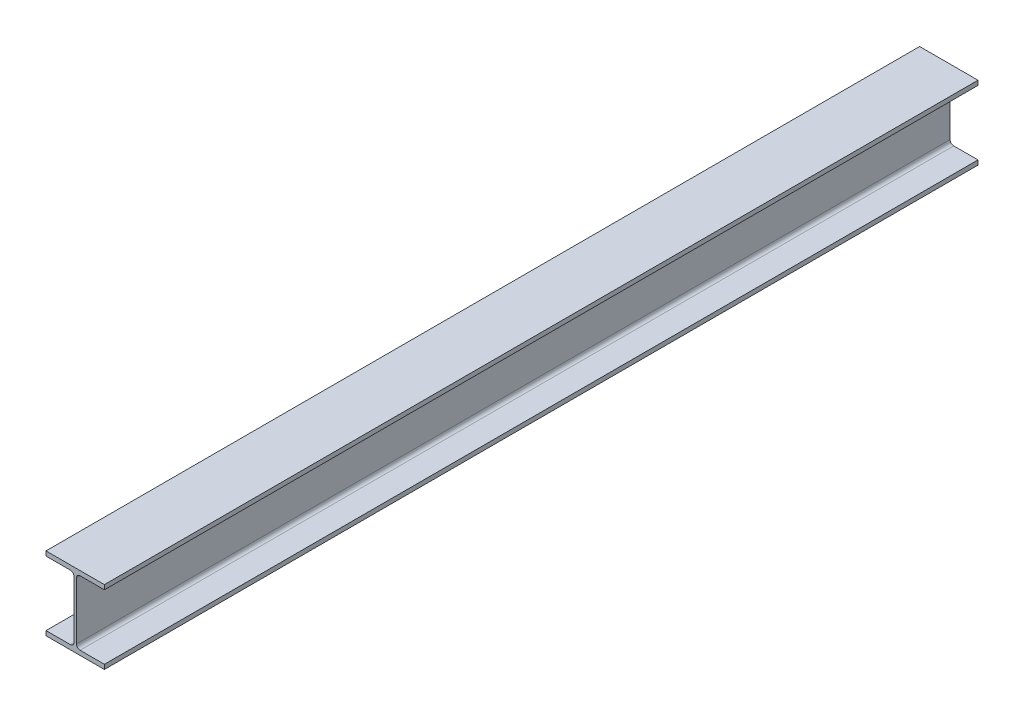
ISO-10303-21;
HEADER;
FILE_DESCRIPTION(('STEP AP214'),'2;1');
FILE_NAME('part.step','',(''),(''),'','','');
FILE_SCHEMA(('AUTOMOTIVE_DESIGN { 1 0 10303 214 1 1 1 1 }'));
ENDSEC;
DATA;
#1=APPLICATION_CONTEXT('core data for automotive mechanical design processes');
#2=APPLICATION_PROTOCOL_DEFINITION('international standard','automotive_design',2000,#1);
#3=PRODUCT_CONTEXT('',#1,'mechanical');
#4=PRODUCT('Part','Part','',(#3));
#5=PRODUCT_RELATED_PRODUCT_CATEGORY('part','',(#4));
#6=PRODUCT_DEFINITION_FORMATION('','',#4);
#7=PRODUCT_DEFINITION_CONTEXT('part definition',#1,'design');
#8=PRODUCT_DEFINITION('design','',#6,#7);
#9=PRODUCT_DEFINITION_SHAPE('','',#8);
#10=(LENGTH_UNIT() NAMED_UNIT(*) SI_UNIT(.MILLI.,.METRE.));
#11=(NAMED_UNIT(*) PLANE_ANGLE_UNIT() SI_UNIT($,.RADIAN.));
#12=(NAMED_UNIT(*) SI_UNIT($,.STERADIAN.) SOLID_ANGLE_UNIT());
#13=UNCERTAINTY_MEASURE_WITH_UNIT(LENGTH_MEASURE(1.E-05),#10,'distance_accuracy_value','');
#14=(GEOMETRIC_REPRESENTATION_CONTEXT(3) GLOBAL_UNCERTAINTY_ASSIGNED_CONTEXT((#13)) GLOBAL_UNIT_ASSIGNED_CONTEXT((#10,
#11,#12)) REPRESENTATION_CONTEXT('',''));
#15=CARTESIAN_POINT('',(0.,0.,0.));
#16=DIRECTION('',(0.,0.,1.));
#17=DIRECTION('',(1.,0.,0.));
#18=AXIS2_PLACEMENT_3D('',#15,#16,#17);
#19=CARTESIAN_POINT('',(203.708,0.,-1524.));
#20=DIRECTION('',(0.,-1.,0.));
#21=DIRECTION('',(0.,0.,-1.));
#22=AXIS2_PLACEMENT_3D('',#19,#20,#21);
#23=PLANE('',#22);
#24=DIRECTION('',(1.,0.,0.));
#25=VECTOR('',#24,1.);
#26=CARTESIAN_POINT('',(203.708,0.,1524.));
#27=LINE('',#26,#25);
#28=CARTESIAN_POINT('',(0.,0.,1524.));
#29=VERTEX_POINT('',#28);
#30=CARTESIAN_POINT('',(203.708,0.,1524.));
#31=VERTEX_POINT('',#30);
#32=EDGE_CURVE('E178',#29,#31,#27,.T.);
#33=ORIENTED_EDGE('',*,*,#32,.F.);
#34=DIRECTION('',(0.,0.,1.));
#35=VECTOR('',#34,1.);
#36=CARTESIAN_POINT('',(0.,0.,-1524.));
#37=LINE('',#36,#35);
#38=CARTESIAN_POINT('',(0.,0.,-1524.));
#39=VERTEX_POINT('',#38);
#40=EDGE_CURVE('E11',#39,#29,#37,.T.);
#41=ORIENTED_EDGE('',*,*,#40,.F.);
#42=DIRECTION('',(1.,0.,0.));
#43=VECTOR('',#42,1.);
#44=CARTESIAN_POINT('',(203.708,0.,-1524.));
#45=LINE('',#44,#43);
#46=CARTESIAN_POINT('',(203.708,0.,-1524.));
#47=VERTEX_POINT('',#46);
#48=EDGE_CURVE('E222',#39,#47,#45,.T.);
#49=ORIENTED_EDGE('',*,*,#48,.T.);
#50=DIRECTION('',(0.,0.,1.));
#51=VECTOR('',#50,1.);
#52=CARTESIAN_POINT('',(203.708,0.,-1524.));
#53=LINE('',#52,#51);
#54=EDGE_CURVE('E36',#47,#31,#53,.T.);
#55=ORIENTED_EDGE('',*,*,#54,.T.);
#56=EDGE_LOOP('',(#33,#41,#49,#55));
#57=FACE_BOUND('',#56,.T.);
#58=ADVANCED_FACE('F33',(#57),#23,.T.);
#59=CARTESIAN_POINT('',(0.,0.,-1524.));
#60=DIRECTION('',(-1.,0.,0.));
#61=DIRECTION('',(0.,-1.,0.));
#62=AXIS2_PLACEMENT_3D('',#59,#60,#61);
#63=PLANE('',#62);
#64=DIRECTION('',(0.,-1.,0.));
#65=VECTOR('',#64,1.);
#66=CARTESIAN_POINT('',(0.,0.,1524.));
#67=LINE('',#66,#65);
#68=CARTESIAN_POINT('',(0.,15.748,1524.));
#69=VERTEX_POINT('',#68);
#70=EDGE_CURVE('E220',#69,#29,#67,.T.);
#71=ORIENTED_EDGE('',*,*,#70,.F.);
#72=DIRECTION('',(0.,0.,1.));
#73=VECTOR('',#72,1.);
#74=CARTESIAN_POINT('',(0.,15.748,-1524.));
#75=LINE('',#74,#73);
#76=CARTESIAN_POINT('',(0.,15.748,-1524.));
#77=VERTEX_POINT('',#76);
#78=EDGE_CURVE('E42',#77,#69,#75,.T.);
#79=ORIENTED_EDGE('',*,*,#78,.F.);
#80=DIRECTION('',(0.,-1.,0.));
#81=VECTOR('',#80,1.);
#82=CARTESIAN_POINT('',(0.,0.,-1524.));
#83=LINE('',#82,#81);
#84=EDGE_CURVE('E168',#77,#39,#83,.T.);
#85=ORIENTED_EDGE('',*,*,#84,.T.);
#86=ORIENTED_EDGE('',*,*,#40,.T.);
#87=EDGE_LOOP('',(#71,#79,#85,#86));
#88=FACE_BOUND('',#87,.T.);
#89=ADVANCED_FACE('F250',(#88),#63,.T.);
#90=CARTESIAN_POINT('',(0.,15.748,-1524.));
#91=DIRECTION('',(0.,1.,0.));
#92=DIRECTION('',(-1.,0.,0.));
#93=AXIS2_PLACEMENT_3D('',#90,#91,#92);
#94=PLANE('',#93);
#95=DIRECTION('',(-1.,0.,0.));
#96=VECTOR('',#95,1.);
#97=CARTESIAN_POINT('',(0.,15.748,1524.));
#98=LINE('',#97,#96);
#99=CARTESIAN_POINT('',(84.709,15.748,1524.));
#100=VERTEX_POINT('',#99);
#101=EDGE_CURVE('E155',#100,#69,#98,.T.);
#102=ORIENTED_EDGE('',*,*,#101,.F.);
#103=DIRECTION('',(0.,0.,1.));
#104=VECTOR('',#103,1.);
#105=CARTESIAN_POINT('',(84.709,15.748,-1524.));
#106=LINE('',#105,#104);
#107=CARTESIAN_POINT('',(84.709,15.748,-1524.));
#108=VERTEX_POINT('',#107);
#109=EDGE_CURVE('E150',#108,#100,#106,.T.);
#110=ORIENTED_EDGE('',*,*,#109,.F.);
#111=DIRECTION('',(-1.,0.,0.));
#112=VECTOR('',#111,1.);
#113=CARTESIAN_POINT('',(0.,15.748,-1524.));
#114=LINE('',#113,#112);
#115=EDGE_CURVE('E153',#108,#77,#114,.T.);
#116=ORIENTED_EDGE('',*,*,#115,.T.);
#117=ORIENTED_EDGE('',*,*,#78,.T.);
#118=EDGE_LOOP('',(#102,#110,#116,#117));
#119=FACE_BOUND('',#118,.T.);
#120=ADVANCED_FACE('F152',(#119),#94,.T.);
#121=CARTESIAN_POINT('',(84.709,28.448,-1524.));
#122=DIRECTION('',(0.,0.,1.));
#123=DIRECTION('',(1.,0.,0.));
#124=AXIS2_PLACEMENT_3D('',#121,#122,#123);
#125=CYLINDRICAL_SURFACE('',#124,12.7);
#126=CARTESIAN_POINT('',(84.709,28.448,1524.));
#127=DIRECTION('',(0.,0.,-1.));
#128=DIRECTION('',(1.,0.,0.));
#129=AXIS2_PLACEMENT_3D('',#126,#127,#128);
#130=CIRCLE('',#129,12.7);
#131=CARTESIAN_POINT('',(97.409,28.448,1524.));
#132=VERTEX_POINT('',#131);
#133=EDGE_CURVE('E217',#132,#100,#130,.T.);
#134=ORIENTED_EDGE('',*,*,#133,.F.);
#135=DIRECTION('',(0.,0.,1.));
#136=VECTOR('',#135,1.);
#137=CARTESIAN_POINT('',(97.409,28.448,-1524.));
#138=LINE('',#137,#136);
#139=CARTESIAN_POINT('',(97.409,28.448,-1524.));
#140=VERTEX_POINT('',#139);
#141=EDGE_CURVE('E160',#140,#132,#138,.T.);
#142=ORIENTED_EDGE('',*,*,#141,.F.);
#143=CARTESIAN_POINT('',(84.709,28.448,-1524.));
#144=DIRECTION('',(0.,0.,-1.));
#145=DIRECTION('',(1.,0.,0.));
#146=AXIS2_PLACEMENT_3D('',#143,#144,#145);
#147=CIRCLE('',#146,12.7);
#148=EDGE_CURVE('E166',#140,#108,#147,.T.);
#149=ORIENTED_EDGE('',*,*,#148,.T.);
#150=ORIENTED_EDGE('',*,*,#109,.T.);
#151=EDGE_LOOP('',(#134,#142,#149,#150));
#152=FACE_BOUND('',#151,.T.);
#153=ADVANCED_FACE('F170',(#152),#125,.F.);
#154=CARTESIAN_POINT('',(97.409,28.448,-1524.));
#155=DIRECTION('',(-1.,0.,0.));
#156=DIRECTION('',(0.,-1.,0.));
#157=AXIS2_PLACEMENT_3D('',#154,#155,#156);
#158=PLANE('',#157);
#159=DIRECTION('',(0.,-1.,0.));
#160=VECTOR('',#159,1.);
#161=CARTESIAN_POINT('',(97.409,28.448,1524.));
#162=LINE('',#161,#160);
#163=CARTESIAN_POINT('',(97.4089999999999,228.092,1524.));
#164=VERTEX_POINT('',#163);
#165=EDGE_CURVE('E214',#164,#132,#162,.T.);
#166=ORIENTED_EDGE('',*,*,#165,.F.);
#167=DIRECTION('',(0.,0.,1.));
#168=VECTOR('',#167,1.);
#169=CARTESIAN_POINT('',(97.4089999999999,228.092,-1524.));
#170=LINE('',#169,#168);
#171=CARTESIAN_POINT('',(97.4089999999999,228.092,-1524.));
#172=VERTEX_POINT('',#171);
#173=EDGE_CURVE('E226',#172,#164,#170,.T.);
#174=ORIENTED_EDGE('',*,*,#173,.F.);
#175=DIRECTION('',(0.,-1.,0.));
#176=VECTOR('',#175,1.);
#177=CARTESIAN_POINT('',(97.409,28.448,-1524.));
#178=LINE('',#177,#176);
#179=EDGE_CURVE('E171',#172,#140,#178,.T.);
#180=ORIENTED_EDGE('',*,*,#179,.T.);
#181=ORIENTED_EDGE('',*,*,#141,.T.);
#182=EDGE_LOOP('',(#166,#174,#180,#181));
#183=FACE_BOUND('',#182,.T.);
#184=ADVANCED_FACE('F263',(#183),#158,.T.);
#185=CARTESIAN_POINT('',(84.7089999999999,228.092,-1524.));
#186=DIRECTION('',(0.,0.,1.));
#187=DIRECTION('',(1.,0.,0.));
#188=AXIS2_PLACEMENT_3D('',#185,#186,#187);
#189=CYLINDRICAL_SURFACE('',#188,12.7);
#190=CARTESIAN_POINT('',(84.7089999999999,228.092,1524.));
#191=DIRECTION('',(0.,0.,-1.));
#192=DIRECTION('',(1.,0.,0.));
#193=AXIS2_PLACEMENT_3D('',#190,#191,#192);
#194=CIRCLE('',#193,12.7);
#195=CARTESIAN_POINT('',(84.7089999999999,240.792,1524.));
#196=VERTEX_POINT('',#195);
#197=EDGE_CURVE('E211',#196,#164,#194,.T.);
#198=ORIENTED_EDGE('',*,*,#197,.F.);
#199=DIRECTION('',(0.,0.,1.));
#200=VECTOR('',#199,1.);
#201=CARTESIAN_POINT('',(84.7089999999999,240.792,-1524.));
#202=LINE('',#201,#200);
#203=CARTESIAN_POINT('',(84.7089999999999,240.792,-1524.));
#204=VERTEX_POINT('',#203);
#205=EDGE_CURVE('E228',#204,#196,#202,.T.);
#206=ORIENTED_EDGE('',*,*,#205,.F.);
#207=CARTESIAN_POINT('',(84.7089999999999,228.092,-1524.));
#208=DIRECTION('',(0.,0.,-1.));
#209=DIRECTION('',(1.,0.,0.));
#210=AXIS2_PLACEMENT_3D('',#207,#208,#209);
#211=CIRCLE('',#210,12.7);
#212=EDGE_CURVE('E173',#204,#172,#211,.T.);
#213=ORIENTED_EDGE('',*,*,#212,.T.);
#214=ORIENTED_EDGE('',*,*,#173,.T.);
#215=EDGE_LOOP('',(#198,#206,#213,#214));
#216=FACE_BOUND('',#215,.T.);
#217=ADVANCED_FACE('F266',(#216),#189,.F.);
#218=CARTESIAN_POINT('',(84.7089999999999,240.792,-1524.));
#219=DIRECTION('',(0.,-1.,0.));
#220=DIRECTION('',(0.,0.,-1.));
#221=AXIS2_PLACEMENT_3D('',#218,#219,#220);
#222=PLANE('',#221);
#223=DIRECTION('',(1.,0.,0.));
#224=VECTOR('',#223,1.);
#225=CARTESIAN_POINT('',(84.7089999999999,240.792,1524.));
#226=LINE('',#225,#224);
#227=CARTESIAN_POINT('',(0.,240.792,1524.));
#228=VERTEX_POINT('',#227);
#229=EDGE_CURVE('E208',#228,#196,#226,.T.);
#230=ORIENTED_EDGE('',*,*,#229,.F.);
#231=DIRECTION('',(0.,0.,1.));
#232=VECTOR('',#231,1.);
#233=CARTESIAN_POINT('',(0.,240.792,-1524.));
#234=LINE('',#233,#232);
#235=CARTESIAN_POINT('',(0.,240.792,-1524.));
#236=VERTEX_POINT('',#235);
#237=EDGE_CURVE('E230',#236,#228,#234,.T.);
#238=ORIENTED_EDGE('',*,*,#237,.F.);
#239=DIRECTION('',(1.,0.,0.));
#240=VECTOR('',#239,1.);
#241=CARTESIAN_POINT('',(84.7089999999999,240.792,-1524.));
#242=LINE('',#241,#240);
#243=EDGE_CURVE('E447',#236,#204,#242,.T.);
#244=ORIENTED_EDGE('',*,*,#243,.T.);
#245=ORIENTED_EDGE('',*,*,#205,.T.);
#246=EDGE_LOOP('',(#230,#238,#244,#245));
#247=FACE_BOUND('',#246,.T.);
#248=ADVANCED_FACE('F270',(#247),#222,.T.);
#249=CARTESIAN_POINT('',(0.,240.792,-1524.));
#250=DIRECTION('',(-1.,0.,0.));
#251=DIRECTION('',(0.,-1.,0.));
#252=AXIS2_PLACEMENT_3D('',#249,#250,#251);
#253=PLANE('',#252);
#254=DIRECTION('',(0.,-1.,0.));
#255=VECTOR('',#254,1.);
#256=CARTESIAN_POINT('',(0.,240.792,1524.));
#257=LINE('',#256,#255);
#258=CARTESIAN_POINT('',(0.,256.54,1524.));
#259=VERTEX_POINT('',#258);
#260=EDGE_CURVE('E205',#259,#228,#257,.T.);
#261=ORIENTED_EDGE('',*,*,#260,.F.);
#262=DIRECTION('',(0.,0.,1.));
#263=VECTOR('',#262,1.);
#264=CARTESIAN_POINT('',(0.,256.54,-1524.));
#265=LINE('',#264,#263);
#266=CARTESIAN_POINT('',(0.,256.54,-1524.));
#267=VERTEX_POINT('',#266);
#268=EDGE_CURVE('E232',#267,#259,#265,.T.);
#269=ORIENTED_EDGE('',*,*,#268,.F.);
#270=DIRECTION('',(0.,-1.,0.));
#271=VECTOR('',#270,1.);
#272=CARTESIAN_POINT('',(0.,240.792,-1524.));
#273=LINE('',#272,#271);
#274=EDGE_CURVE('E443',#267,#236,#273,.T.);
#275=ORIENTED_EDGE('',*,*,#274,.T.);
#276=ORIENTED_EDGE('',*,*,#237,.T.);
#277=EDGE_LOOP('',(#261,#269,#275,#276));
#278=FACE_BOUND('',#277,.T.);
#279=ADVANCED_FACE('F274',(#278),#253,.T.);
#280=CARTESIAN_POINT('',(0.,256.54,-1524.));
#281=DIRECTION('',(0.,1.,0.));
#282=DIRECTION('',(0.,0.,1.));
#283=AXIS2_PLACEMENT_3D('',#280,#281,#282);
#284=PLANE('',#283);
#285=DIRECTION('',(-1.,0.,0.));
#286=VECTOR('',#285,1.);
#287=CARTESIAN_POINT('',(0.,256.54,1524.));
#288=LINE('',#287,#286);
#289=CARTESIAN_POINT('',(203.708,256.54,1524.));
#290=VERTEX_POINT('',#289);
#291=EDGE_CURVE('E202',#290,#259,#288,.T.);
#292=ORIENTED_EDGE('',*,*,#291,.F.);
#293=DIRECTION('',(0.,0.,1.));
#294=VECTOR('',#293,1.);
#295=CARTESIAN_POINT('',(203.708,256.54,-1524.));
#296=LINE('',#295,#294);
#297=CARTESIAN_POINT('',(203.708,256.54,-1524.));
#298=VERTEX_POINT('',#297);
#299=EDGE_CURVE('E234',#298,#290,#296,.T.);
#300=ORIENTED_EDGE('',*,*,#299,.F.);
#301=DIRECTION('',(-1.,0.,0.));
#302=VECTOR('',#301,1.);
#303=CARTESIAN_POINT('',(0.,256.54,-1524.));
#304=LINE('',#303,#302);
#305=EDGE_CURVE('E454',#298,#267,#304,.T.);
#306=ORIENTED_EDGE('',*,*,#305,.T.);
#307=ORIENTED_EDGE('',*,*,#268,.T.);
#308=EDGE_LOOP('',(#292,#300,#306,#307));
#309=FACE_BOUND('',#308,.T.);
#310=ADVANCED_FACE('F278',(#309),#284,.T.);
#311=CARTESIAN_POINT('',(203.708,256.54,-1524.));
#312=DIRECTION('',(1.,0.,0.));
#313=DIRECTION('',(0.,1.,0.));
#314=AXIS2_PLACEMENT_3D('',#311,#312,#313);
#315=PLANE('',#314);
#316=DIRECTION('',(0.,1.,0.));
#317=VECTOR('',#316,1.);
#318=CARTESIAN_POINT('',(203.708,256.54,1524.));
#319=LINE('',#318,#317);
#320=CARTESIAN_POINT('',(203.708,240.792,1524.));
#321=VERTEX_POINT('',#320);
#322=EDGE_CURVE('E199',#321,#290,#319,.T.);
#323=ORIENTED_EDGE('',*,*,#322,.F.);
#324=DIRECTION('',(0.,0.,1.));
#325=VECTOR('',#324,1.);
#326=CARTESIAN_POINT('',(203.708,240.792,-1524.));
#327=LINE('',#326,#325);
#328=CARTESIAN_POINT('',(203.708,240.792,-1524.));
#329=VERTEX_POINT('',#328);
#330=EDGE_CURVE('E236',#329,#321,#327,.T.);
#331=ORIENTED_EDGE('',*,*,#330,.F.);
#332=DIRECTION('',(0.,1.,0.));
#333=VECTOR('',#332,1.);
#334=CARTESIAN_POINT('',(203.708,256.54,-1524.));
#335=LINE('',#334,#333);
#336=EDGE_CURVE('E436',#329,#298,#335,.T.);
#337=ORIENTED_EDGE('',*,*,#336,.T.);
#338=ORIENTED_EDGE('',*,*,#299,.T.);
#339=EDGE_LOOP('',(#323,#331,#337,#338));
#340=FACE_BOUND('',#339,.T.);
#341=ADVANCED_FACE('F282',(#340),#315,.T.);
#342=CARTESIAN_POINT('',(203.708,240.792,-1524.));
#343=DIRECTION('',(0.,-1.,0.));
#344=DIRECTION('',(0.,0.,-1.));
#345=AXIS2_PLACEMENT_3D('',#342,#343,#344);
#346=PLANE('',#345);
#347=DIRECTION('',(1.,0.,0.));
#348=VECTOR('',#347,1.);
#349=CARTESIAN_POINT('',(203.708,240.792,1524.));
#350=LINE('',#349,#348);
#351=CARTESIAN_POINT('',(118.999,240.792,1524.));
#352=VERTEX_POINT('',#351);
#353=EDGE_CURVE('E196',#352,#321,#350,.T.);
#354=ORIENTED_EDGE('',*,*,#353,.F.);
#355=DIRECTION('',(0.,0.,1.));
#356=VECTOR('',#355,1.);
#357=CARTESIAN_POINT('',(118.999,240.792,-1524.));
#358=LINE('',#357,#356);
#359=CARTESIAN_POINT('',(118.999,240.792,-1524.));
#360=VERTEX_POINT('',#359);
#361=EDGE_CURVE('E238',#360,#352,#358,.T.);
#362=ORIENTED_EDGE('',*,*,#361,.F.);
#363=DIRECTION('',(1.,0.,0.));
#364=VECTOR('',#363,1.);
#365=CARTESIAN_POINT('',(203.708,240.792,-1524.));
#366=LINE('',#365,#364);
#367=EDGE_CURVE('E432',#360,#329,#366,.T.);
#368=ORIENTED_EDGE('',*,*,#367,.T.);
#369=ORIENTED_EDGE('',*,*,#330,.T.);
#370=EDGE_LOOP('',(#354,#362,#368,#369));
#371=FACE_BOUND('',#370,.T.);
#372=ADVANCED_FACE('F286',(#371),#346,.T.);
#373=CARTESIAN_POINT('',(118.999,228.092,-1524.));
#374=DIRECTION('',(0.,0.,1.));
#375=DIRECTION('',(1.,0.,0.));
#376=AXIS2_PLACEMENT_3D('',#373,#374,#375);
#377=CYLINDRICAL_SURFACE('',#376,12.7);
#378=CARTESIAN_POINT('',(118.999,228.092,1524.));
#379=DIRECTION('',(0.,0.,-1.));
#380=DIRECTION('',(1.,0.,0.));
#381=AXIS2_PLACEMENT_3D('',#378,#379,#380);
#382=CIRCLE('',#381,12.7);
#383=CARTESIAN_POINT('',(106.299,228.092,1524.));
#384=VERTEX_POINT('',#383);
#385=EDGE_CURVE('E193',#384,#352,#382,.T.);
#386=ORIENTED_EDGE('',*,*,#385,.F.);
#387=DIRECTION('',(0.,0.,1.));
#388=VECTOR('',#387,1.);
#389=CARTESIAN_POINT('',(106.299,228.092,-1524.));
#390=LINE('',#389,#388);
#391=CARTESIAN_POINT('',(106.299,228.092,-1524.));
#392=VERTEX_POINT('',#391);
#393=EDGE_CURVE('E240',#392,#384,#390,.T.);
#394=ORIENTED_EDGE('',*,*,#393,.F.);
#395=CARTESIAN_POINT('',(118.999,228.092,-1524.));
#396=DIRECTION('',(0.,0.,-1.));
#397=DIRECTION('',(1.,0.,0.));
#398=AXIS2_PLACEMENT_3D('',#395,#396,#397);
#399=CIRCLE('',#398,12.7);
#400=EDGE_CURVE('E458',#392,#360,#399,.T.);
#401=ORIENTED_EDGE('',*,*,#400,.T.);
#402=ORIENTED_EDGE('',*,*,#361,.T.);
#403=EDGE_LOOP('',(#386,#394,#401,#402));
#404=FACE_BOUND('',#403,.T.);
#405=ADVANCED_FACE('F290',(#404),#377,.F.);
#406=CARTESIAN_POINT('',(106.299,228.092,-1524.));
#407=DIRECTION('',(1.,0.,0.));
#408=DIRECTION('',(0.,1.,0.));
#409=AXIS2_PLACEMENT_3D('',#406,#407,#408);
#410=PLANE('',#409);
#411=DIRECTION('',(0.,1.,0.));
#412=VECTOR('',#411,1.);
#413=CARTESIAN_POINT('',(106.299,228.092,1524.));
#414=LINE('',#413,#412);
#415=CARTESIAN_POINT('',(106.299,28.448,1524.));
#416=VERTEX_POINT('',#415);
#417=EDGE_CURVE('E190',#416,#384,#414,.T.);
#418=ORIENTED_EDGE('',*,*,#417,.F.);
#419=DIRECTION('',(0.,0.,1.));
#420=VECTOR('',#419,1.);
#421=CARTESIAN_POINT('',(106.299,28.448,-1524.));
#422=LINE('',#421,#420);
#423=CARTESIAN_POINT('',(106.299,28.448,-1524.));
#424=VERTEX_POINT('',#423);
#425=EDGE_CURVE('E242',#424,#416,#422,.T.);
#426=ORIENTED_EDGE('',*,*,#425,.F.);
#427=DIRECTION('',(0.,1.,0.));
#428=VECTOR('',#427,1.);
#429=CARTESIAN_POINT('',(106.299,228.092,-1524.));
#430=LINE('',#429,#428);
#431=EDGE_CURVE('E425',#424,#392,#430,.T.);
#432=ORIENTED_EDGE('',*,*,#431,.T.);
#433=ORIENTED_EDGE('',*,*,#393,.T.);
#434=EDGE_LOOP('',(#418,#426,#432,#433));
#435=FACE_BOUND('',#434,.T.);
#436=ADVANCED_FACE('F294',(#435),#410,.T.);
#437=CARTESIAN_POINT('',(118.999,28.448,-1524.));
#438=DIRECTION('',(0.,0.,1.));
#439=DIRECTION('',(1.,0.,0.));
#440=AXIS2_PLACEMENT_3D('',#437,#438,#439);
#441=CYLINDRICAL_SURFACE('',#440,12.7);
#442=CARTESIAN_POINT('',(118.999,28.448,1524.));
#443=DIRECTION('',(0.,0.,-1.));
#444=DIRECTION('',(1.,0.,0.));
#445=AXIS2_PLACEMENT_3D('',#442,#443,#444);
#446=CIRCLE('',#445,12.7);
#447=CARTESIAN_POINT('',(118.999,15.748,1524.));
#448=VERTEX_POINT('',#447);
#449=EDGE_CURVE('E187',#448,#416,#446,.T.);
#450=ORIENTED_EDGE('',*,*,#449,.F.);
#451=DIRECTION('',(0.,0.,1.));
#452=VECTOR('',#451,1.);
#453=CARTESIAN_POINT('',(118.999,15.748,-1524.));
#454=LINE('',#453,#452);
#455=CARTESIAN_POINT('',(118.999,15.748,-1524.));
#456=VERTEX_POINT('',#455);
#457=EDGE_CURVE('E244',#456,#448,#454,.T.);
#458=ORIENTED_EDGE('',*,*,#457,.F.);
#459=CARTESIAN_POINT('',(118.999,28.448,-1524.));
#460=DIRECTION('',(0.,0.,-1.));
#461=DIRECTION('',(1.,0.,0.));
#462=AXIS2_PLACEMENT_3D('',#459,#460,#461);
#463=CIRCLE('',#462,12.7);
#464=EDGE_CURVE('E421',#456,#424,#463,.T.);
#465=ORIENTED_EDGE('',*,*,#464,.T.);
#466=ORIENTED_EDGE('',*,*,#425,.T.);
#467=EDGE_LOOP('',(#450,#458,#465,#466));
#468=FACE_BOUND('',#467,.T.);
#469=ADVANCED_FACE('F298',(#468),#441,.F.);
#470=CARTESIAN_POINT('',(118.999,15.748,-1524.));
#471=DIRECTION('',(0.,1.,0.));
#472=DIRECTION('',(-1.,0.,0.));
#473=AXIS2_PLACEMENT_3D('',#470,#471,#472);
#474=PLANE('',#473);
#475=DIRECTION('',(-1.,0.,0.));
#476=VECTOR('',#475,1.);
#477=CARTESIAN_POINT('',(118.999,15.748,1524.));
#478=LINE('',#477,#476);
#479=CARTESIAN_POINT('',(203.708,15.748,1524.));
#480=VERTEX_POINT('',#479);
#481=EDGE_CURVE('E184',#480,#448,#478,.T.);
#482=ORIENTED_EDGE('',*,*,#481,.F.);
#483=DIRECTION('',(0.,0.,1.));
#484=VECTOR('',#483,1.);
#485=CARTESIAN_POINT('',(203.708,15.748,-1524.));
#486=LINE('',#485,#484);
#487=CARTESIAN_POINT('',(203.708,15.748,-1524.));
#488=VERTEX_POINT('',#487);
#489=EDGE_CURVE('E245',#488,#480,#486,.T.);
#490=ORIENTED_EDGE('',*,*,#489,.F.);
#491=DIRECTION('',(-1.,0.,0.));
#492=VECTOR('',#491,1.);
#493=CARTESIAN_POINT('',(118.999,15.748,-1524.));
#494=LINE('',#493,#492);
#495=EDGE_CURVE('E462',#488,#456,#494,.T.);
#496=ORIENTED_EDGE('',*,*,#495,.T.);
#497=ORIENTED_EDGE('',*,*,#457,.T.);
#498=EDGE_LOOP('',(#482,#490,#496,#497));
#499=FACE_BOUND('',#498,.T.);
#500=ADVANCED_FACE('F302',(#499),#474,.T.);
#501=CARTESIAN_POINT('',(203.708,15.748,-1524.));
#502=DIRECTION('',(1.,0.,0.));
#503=DIRECTION('',(0.,0.,-1.));
#504=AXIS2_PLACEMENT_3D('',#501,#502,#503);
#505=PLANE('',#504);
#506=DIRECTION('',(0.,1.,0.));
#507=VECTOR('',#506,1.);
#508=CARTESIAN_POINT('',(203.708,15.748,1524.));
#509=LINE('',#508,#507);
#510=EDGE_CURVE('E181',#31,#480,#509,.T.);
#511=ORIENTED_EDGE('',*,*,#510,.F.);
#512=ORIENTED_EDGE('',*,*,#54,.F.);
#513=DIRECTION('',(0.,1.,0.));
#514=VECTOR('',#513,1.);
#515=CARTESIAN_POINT('',(203.708,15.748,-1524.));
#516=LINE('',#515,#514);
#517=EDGE_CURVE('E464',#47,#488,#516,.T.);
#518=ORIENTED_EDGE('',*,*,#517,.T.);
#519=ORIENTED_EDGE('',*,*,#489,.T.);
#520=EDGE_LOOP('',(#511,#512,#518,#519));
#521=FACE_BOUND('',#520,.T.);
#522=ADVANCED_FACE('F247',(#521),#505,.T.);
#523=CARTESIAN_POINT('',(84.709,28.448,-1524.));
#524=DIRECTION('',(0.,0.,1.));
#525=DIRECTION('',(1.,0.,0.));
#526=AXIS2_PLACEMENT_3D('',#523,#524,#525);
#527=PLANE('',#526);
#528=ORIENTED_EDGE('',*,*,#48,.F.);
#529=ORIENTED_EDGE('',*,*,#84,.F.);
#530=ORIENTED_EDGE('',*,*,#115,.F.);
#531=ORIENTED_EDGE('',*,*,#148,.F.);
#532=ORIENTED_EDGE('',*,*,#179,.F.);
#533=ORIENTED_EDGE('',*,*,#212,.F.);
#534=ORIENTED_EDGE('',*,*,#243,.F.);
#535=ORIENTED_EDGE('',*,*,#274,.F.);
#536=ORIENTED_EDGE('',*,*,#305,.F.);
#537=ORIENTED_EDGE('',*,*,#336,.F.);
#538=ORIENTED_EDGE('',*,*,#367,.F.);
#539=ORIENTED_EDGE('',*,*,#400,.F.);
#540=ORIENTED_EDGE('',*,*,#431,.F.);
#541=ORIENTED_EDGE('',*,*,#464,.F.);
#542=ORIENTED_EDGE('',*,*,#495,.F.);
#543=ORIENTED_EDGE('',*,*,#517,.F.);
#544=EDGE_LOOP('',(#528,#529,#530,#531,#532,#533,#534,#535,#536,#537,#538,#539,#540,#541,#542,#543));
#545=FACE_BOUND('',#544,.T.);
#546=ADVANCED_FACE('F164',(#545),#527,.F.);
#547=CARTESIAN_POINT('',(84.709,28.448,1524.));
#548=DIRECTION('',(0.,0.,1.));
#549=DIRECTION('',(1.,0.,0.));
#550=AXIS2_PLACEMENT_3D('',#547,#548,#549);
#551=PLANE('',#550);
#552=ORIENTED_EDGE('',*,*,#32,.T.);
#553=ORIENTED_EDGE('',*,*,#510,.T.);
#554=ORIENTED_EDGE('',*,*,#481,.T.);
#555=ORIENTED_EDGE('',*,*,#449,.T.);
#556=ORIENTED_EDGE('',*,*,#417,.T.);
#557=ORIENTED_EDGE('',*,*,#385,.T.);
#558=ORIENTED_EDGE('',*,*,#353,.T.);
#559=ORIENTED_EDGE('',*,*,#322,.T.);
#560=ORIENTED_EDGE('',*,*,#291,.T.);
#561=ORIENTED_EDGE('',*,*,#260,.T.);
#562=ORIENTED_EDGE('',*,*,#229,.T.);
#563=ORIENTED_EDGE('',*,*,#197,.T.);
#564=ORIENTED_EDGE('',*,*,#165,.T.);
#565=ORIENTED_EDGE('',*,*,#133,.T.);
#566=ORIENTED_EDGE('',*,*,#101,.T.);
#567=ORIENTED_EDGE('',*,*,#70,.T.);
#568=EDGE_LOOP('',(#552,#553,#554,#555,#556,#557,#558,#559,#560,#561,#562,#563,#564,#565,#566,#567));
#569=FACE_BOUND('',#568,.T.);
#570=ADVANCED_FACE('F249',(#569),#551,.T.);
#571=CLOSED_SHELL('',(#58,#89,#120,#153,#184,#217,#248,#279,#310,#341,#372,#405,#436,#469,#500,
#522,#546,#570));
#572=MANIFOLD_SOLID_BREP('B2',#571);
#573=ADVANCED_BREP_SHAPE_REPRESENTATION('',(#18,#572),#14);
#574=SHAPE_DEFINITION_REPRESENTATION(#9,#573);
ENDSEC;
END-ISO-10303-21;
